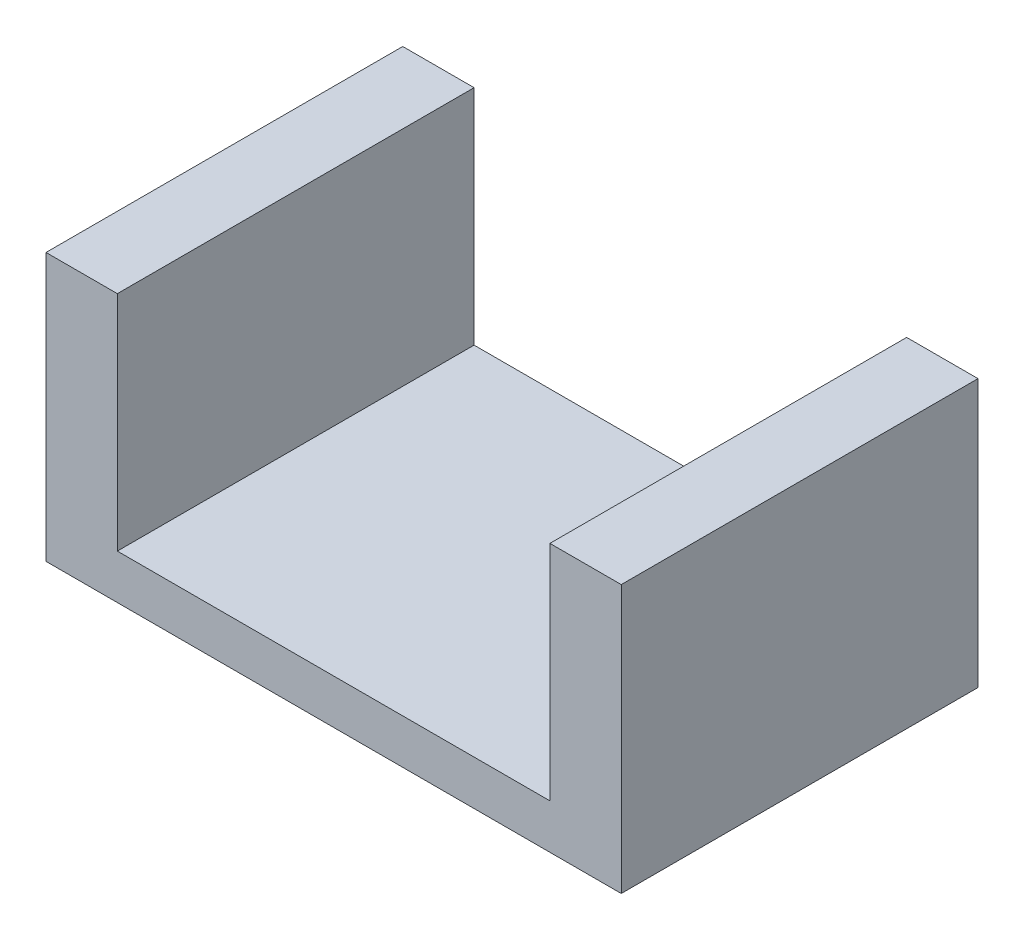
ISO-10303-21;
HEADER;
FILE_DESCRIPTION(('STEP AP214'),'2;1');
FILE_NAME('part.step','',(''),(''),'','','');
FILE_SCHEMA(('AUTOMOTIVE_DESIGN { 1 0 10303 214 1 1 1 1 }'));
ENDSEC;
DATA;
#1=APPLICATION_CONTEXT('core data for automotive mechanical design processes');
#2=APPLICATION_PROTOCOL_DEFINITION('international standard','automotive_design',2000,#1);
#3=PRODUCT_CONTEXT('',#1,'mechanical');
#4=PRODUCT('Part','Part','',(#3));
#5=PRODUCT_RELATED_PRODUCT_CATEGORY('part','',(#4));
#6=PRODUCT_DEFINITION_FORMATION('','',#4);
#7=PRODUCT_DEFINITION_CONTEXT('part definition',#1,'design');
#8=PRODUCT_DEFINITION('design','',#6,#7);
#9=PRODUCT_DEFINITION_SHAPE('','',#8);
#10=(LENGTH_UNIT() NAMED_UNIT(*) SI_UNIT(.MILLI.,.METRE.));
#11=(NAMED_UNIT(*) PLANE_ANGLE_UNIT() SI_UNIT($,.RADIAN.));
#12=(NAMED_UNIT(*) SI_UNIT($,.STERADIAN.) SOLID_ANGLE_UNIT());
#13=UNCERTAINTY_MEASURE_WITH_UNIT(LENGTH_MEASURE(1.E-05),#10,'distance_accuracy_value','');
#14=(GEOMETRIC_REPRESENTATION_CONTEXT(3) GLOBAL_UNCERTAINTY_ASSIGNED_CONTEXT((#13)) GLOBAL_UNIT_ASSIGNED_CONTEXT((#10,
#11,#12)) REPRESENTATION_CONTEXT('',''));
#15=CARTESIAN_POINT('',(0.,0.,0.));
#16=DIRECTION('',(0.,0.,1.));
#17=DIRECTION('',(1.,0.,0.));
#18=AXIS2_PLACEMENT_3D('',#15,#16,#17);
#19=CARTESIAN_POINT('',(-12.9,-15.,5.));
#20=DIRECTION('',(0.,1.,0.));
#21=DIRECTION('',(1.,0.,0.));
#22=AXIS2_PLACEMENT_3D('',#19,#20,#21);
#23=PLANE('',#22);
#24=DIRECTION('',(0.,0.,1.));
#25=VECTOR('',#24,1.);
#26=CARTESIAN_POINT('',(12.9,-15.,5.));
#27=LINE('',#26,#25);
#28=CARTESIAN_POINT('',(12.9,-15.,5.));
#29=VERTEX_POINT('',#28);
#30=CARTESIAN_POINT('',(12.9,-15.,21.));
#31=VERTEX_POINT('',#30);
#32=EDGE_CURVE('E165',#29,#31,#27,.T.);
#33=ORIENTED_EDGE('',*,*,#32,.T.);
#34=DIRECTION('',(-1.,0.,0.));
#35=VECTOR('',#34,1.);
#36=CARTESIAN_POINT('',(12.9,-15.,21.));
#37=LINE('',#36,#35);
#38=CARTESIAN_POINT('',(-12.9,-15.,21.));
#39=VERTEX_POINT('',#38);
#40=EDGE_CURVE('E129',#31,#39,#37,.T.);
#41=ORIENTED_EDGE('',*,*,#40,.T.);
#42=DIRECTION('',(0.,0.,1.));
#43=VECTOR('',#42,1.);
#44=CARTESIAN_POINT('',(-12.9,-15.,5.));
#45=LINE('',#44,#43);
#46=CARTESIAN_POINT('',(-12.9,-15.,5.));
#47=VERTEX_POINT('',#46);
#48=EDGE_CURVE('E123',#47,#39,#45,.T.);
#49=ORIENTED_EDGE('',*,*,#48,.F.);
#50=DIRECTION('',(1.,0.,0.));
#51=VECTOR('',#50,1.);
#52=CARTESIAN_POINT('',(-12.9,-15.,5.));
#53=LINE('',#52,#51);
#54=EDGE_CURVE('E9',#47,#29,#53,.T.);
#55=ORIENTED_EDGE('',*,*,#54,.T.);
#56=EDGE_LOOP('',(#33,#41,#49,#55));
#57=FACE_BOUND('',#56,.T.);
#58=ADVANCED_FACE('F15',(#57),#23,.F.);
#59=CARTESIAN_POINT('',(-12.9,-15.,5.));
#60=DIRECTION('',(0.,0.,1.));
#61=DIRECTION('',(1.,0.,0.));
#62=AXIS2_PLACEMENT_3D('',#59,#60,#61);
#63=PLANE('',#62);
#64=DIRECTION('',(1.,0.,0.));
#65=VECTOR('',#64,1.);
#66=CARTESIAN_POINT('',(-12.9,-3.,5.));
#67=LINE('',#66,#65);
#68=CARTESIAN_POINT('',(-12.9,-3.,5.));
#69=VERTEX_POINT('',#68);
#70=CARTESIAN_POINT('',(-9.7,-3.,5.));
#71=VERTEX_POINT('',#70);
#72=EDGE_CURVE('E24',#69,#71,#67,.T.);
#73=ORIENTED_EDGE('',*,*,#72,.T.);
#74=DIRECTION('',(0.,1.,0.));
#75=VECTOR('',#74,1.);
#76=CARTESIAN_POINT('',(-9.7,-15.,5.));
#77=LINE('',#76,#75);
#78=CARTESIAN_POINT('',(-9.7,-13.,5.));
#79=VERTEX_POINT('',#78);
#80=EDGE_CURVE('E101',#79,#71,#77,.T.);
#81=ORIENTED_EDGE('',*,*,#80,.F.);
#82=DIRECTION('',(1.,0.,0.));
#83=VECTOR('',#82,1.);
#84=CARTESIAN_POINT('',(-12.9,-13.,5.));
#85=LINE('',#84,#83);
#86=CARTESIAN_POINT('',(9.7,-13.,5.));
#87=VERTEX_POINT('',#86);
#88=EDGE_CURVE('E92',#79,#87,#85,.T.);
#89=ORIENTED_EDGE('',*,*,#88,.T.);
#90=DIRECTION('',(0.,1.,0.));
#91=VECTOR('',#90,1.);
#92=CARTESIAN_POINT('',(9.7,-15.,5.));
#93=LINE('',#92,#91);
#94=CARTESIAN_POINT('',(9.7,-3.,5.));
#95=VERTEX_POINT('',#94);
#96=EDGE_CURVE('E77',#87,#95,#93,.T.);
#97=ORIENTED_EDGE('',*,*,#96,.T.);
#98=DIRECTION('',(1.,0.,0.));
#99=VECTOR('',#98,1.);
#100=CARTESIAN_POINT('',(9.7,-3.,5.));
#101=LINE('',#100,#99);
#102=CARTESIAN_POINT('',(12.9,-3.,5.));
#103=VERTEX_POINT('',#102);
#104=EDGE_CURVE('E88',#95,#103,#101,.T.);
#105=ORIENTED_EDGE('',*,*,#104,.T.);
#106=DIRECTION('',(0.,-1.,0.));
#107=VECTOR('',#106,1.);
#108=CARTESIAN_POINT('',(12.9,-3.,5.));
#109=LINE('',#108,#107);
#110=EDGE_CURVE('E168',#103,#29,#109,.T.);
#111=ORIENTED_EDGE('',*,*,#110,.T.);
#112=ORIENTED_EDGE('',*,*,#54,.F.);
#113=DIRECTION('',(0.,-1.,0.));
#114=VECTOR('',#113,1.);
#115=CARTESIAN_POINT('',(-12.9,-3.,5.));
#116=LINE('',#115,#114);
#117=EDGE_CURVE('E119',#69,#47,#116,.T.);
#118=ORIENTED_EDGE('',*,*,#117,.F.);
#119=EDGE_LOOP('',(#73,#81,#89,#97,#105,#111,#112,#118));
#120=FACE_BOUND('',#119,.T.);
#121=ADVANCED_FACE('F99',(#120),#63,.F.);
#122=CARTESIAN_POINT('',(-12.9,-3.,5.));
#123=DIRECTION('',(0.,1.,0.));
#124=DIRECTION('',(1.,0.,0.));
#125=AXIS2_PLACEMENT_3D('',#122,#123,#124);
#126=PLANE('',#125);
#127=ORIENTED_EDGE('',*,*,#72,.F.);
#128=DIRECTION('',(0.,0.,1.));
#129=VECTOR('',#128,1.);
#130=CARTESIAN_POINT('',(-12.9,-3.,5.));
#131=LINE('',#130,#129);
#132=CARTESIAN_POINT('',(-12.9,-3.,21.));
#133=VERTEX_POINT('',#132);
#134=EDGE_CURVE('E115',#69,#133,#131,.T.);
#135=ORIENTED_EDGE('',*,*,#134,.T.);
#136=DIRECTION('',(1.,0.,0.));
#137=VECTOR('',#136,1.);
#138=CARTESIAN_POINT('',(-12.9,-3.,21.));
#139=LINE('',#138,#137);
#140=CARTESIAN_POINT('',(-9.7,-3.,21.));
#141=VERTEX_POINT('',#140);
#142=EDGE_CURVE('E148',#133,#141,#139,.T.);
#143=ORIENTED_EDGE('',*,*,#142,.T.);
#144=DIRECTION('',(0.,0.,1.));
#145=VECTOR('',#144,1.);
#146=CARTESIAN_POINT('',(-9.7,-3.,5.));
#147=LINE('',#146,#145);
#148=EDGE_CURVE('E104',#71,#141,#147,.T.);
#149=ORIENTED_EDGE('',*,*,#148,.F.);
#150=EDGE_LOOP('',(#127,#135,#143,#149));
#151=FACE_BOUND('',#150,.T.);
#152=ADVANCED_FACE('F177',(#151),#126,.T.);
#153=CARTESIAN_POINT('',(12.9,-15.,5.));
#154=DIRECTION('',(1.,0.,0.));
#155=DIRECTION('',(0.,1.,0.));
#156=AXIS2_PLACEMENT_3D('',#153,#154,#155);
#157=PLANE('',#156);
#158=ORIENTED_EDGE('',*,*,#32,.F.);
#159=ORIENTED_EDGE('',*,*,#110,.F.);
#160=DIRECTION('',(0.,0.,1.));
#161=VECTOR('',#160,1.);
#162=CARTESIAN_POINT('',(12.9,-3.,5.));
#163=LINE('',#162,#161);
#164=CARTESIAN_POINT('',(12.9,-3.,21.));
#165=VERTEX_POINT('',#164);
#166=EDGE_CURVE('E161',#103,#165,#163,.T.);
#167=ORIENTED_EDGE('',*,*,#166,.T.);
#168=DIRECTION('',(0.,1.,0.));
#169=VECTOR('',#168,1.);
#170=CARTESIAN_POINT('',(12.9,-15.,21.));
#171=LINE('',#170,#169);
#172=EDGE_CURVE('E124',#31,#165,#171,.T.);
#173=ORIENTED_EDGE('',*,*,#172,.F.);
#174=EDGE_LOOP('',(#158,#159,#167,#173));
#175=FACE_BOUND('',#174,.T.);
#176=ADVANCED_FACE('F228',(#175),#157,.T.);
#177=CARTESIAN_POINT('',(9.7,-3.,5.));
#178=DIRECTION('',(0.,1.,0.));
#179=DIRECTION('',(1.,0.,0.));
#180=AXIS2_PLACEMENT_3D('',#177,#178,#179);
#181=PLANE('',#180);
#182=ORIENTED_EDGE('',*,*,#104,.F.);
#183=DIRECTION('',(0.,0.,1.));
#184=VECTOR('',#183,1.);
#185=CARTESIAN_POINT('',(9.7,-3.,5.));
#186=LINE('',#185,#184);
#187=CARTESIAN_POINT('',(9.7,-3.,21.));
#188=VERTEX_POINT('',#187);
#189=EDGE_CURVE('E83',#95,#188,#186,.T.);
#190=ORIENTED_EDGE('',*,*,#189,.T.);
#191=DIRECTION('',(1.,0.,0.));
#192=VECTOR('',#191,1.);
#193=CARTESIAN_POINT('',(9.7,-3.,21.));
#194=LINE('',#193,#192);
#195=EDGE_CURVE('E128',#188,#165,#194,.T.);
#196=ORIENTED_EDGE('',*,*,#195,.T.);
#197=ORIENTED_EDGE('',*,*,#166,.F.);
#198=EDGE_LOOP('',(#182,#190,#196,#197));
#199=FACE_BOUND('',#198,.T.);
#200=ADVANCED_FACE('F190',(#199),#181,.T.);
#201=CARTESIAN_POINT('',(9.7,-15.,5.));
#202=DIRECTION('',(1.,0.,0.));
#203=DIRECTION('',(0.,1.,0.));
#204=AXIS2_PLACEMENT_3D('',#201,#202,#203);
#205=PLANE('',#204);
#206=ORIENTED_EDGE('',*,*,#189,.F.);
#207=ORIENTED_EDGE('',*,*,#96,.F.);
#208=DIRECTION('',(0.,0.,-1.));
#209=VECTOR('',#208,1.);
#210=CARTESIAN_POINT('',(9.7,-13.,5.));
#211=LINE('',#210,#209);
#212=CARTESIAN_POINT('',(9.7,-13.,21.));
#213=VERTEX_POINT('',#212);
#214=EDGE_CURVE('E81',#213,#87,#211,.T.);
#215=ORIENTED_EDGE('',*,*,#214,.F.);
#216=DIRECTION('',(0.,1.,0.));
#217=VECTOR('',#216,1.);
#218=CARTESIAN_POINT('',(9.7,-15.,21.));
#219=LINE('',#218,#217);
#220=EDGE_CURVE('E139',#213,#188,#219,.T.);
#221=ORIENTED_EDGE('',*,*,#220,.T.);
#222=EDGE_LOOP('',(#206,#207,#215,#221));
#223=FACE_BOUND('',#222,.T.);
#224=ADVANCED_FACE('F79',(#223),#205,.F.);
#225=CARTESIAN_POINT('',(-12.9,-13.,5.));
#226=DIRECTION('',(0.,1.,0.));
#227=DIRECTION('',(1.,0.,0.));
#228=AXIS2_PLACEMENT_3D('',#225,#226,#227);
#229=PLANE('',#228);
#230=ORIENTED_EDGE('',*,*,#88,.F.);
#231=DIRECTION('',(0.,0.,-1.));
#232=VECTOR('',#231,1.);
#233=CARTESIAN_POINT('',(-9.7,-13.,5.));
#234=LINE('',#233,#232);
#235=CARTESIAN_POINT('',(-9.7,-13.,21.));
#236=VERTEX_POINT('',#235);
#237=EDGE_CURVE('E149',#236,#79,#234,.T.);
#238=ORIENTED_EDGE('',*,*,#237,.F.);
#239=DIRECTION('',(1.,0.,0.));
#240=VECTOR('',#239,1.);
#241=CARTESIAN_POINT('',(-12.9,-13.,21.));
#242=LINE('',#241,#240);
#243=EDGE_CURVE('E95',#236,#213,#242,.T.);
#244=ORIENTED_EDGE('',*,*,#243,.T.);
#245=ORIENTED_EDGE('',*,*,#214,.T.);
#246=EDGE_LOOP('',(#230,#238,#244,#245));
#247=FACE_BOUND('',#246,.T.);
#248=ADVANCED_FACE('F91',(#247),#229,.T.);
#249=CARTESIAN_POINT('',(-9.7,-15.,5.));
#250=DIRECTION('',(1.,0.,0.));
#251=DIRECTION('',(0.,1.,0.));
#252=AXIS2_PLACEMENT_3D('',#249,#250,#251);
#253=PLANE('',#252);
#254=DIRECTION('',(0.,1.,0.));
#255=VECTOR('',#254,1.);
#256=CARTESIAN_POINT('',(-9.7,-15.,21.));
#257=LINE('',#256,#255);
#258=EDGE_CURVE('E144',#236,#141,#257,.T.);
#259=ORIENTED_EDGE('',*,*,#258,.F.);
#260=ORIENTED_EDGE('',*,*,#237,.T.);
#261=ORIENTED_EDGE('',*,*,#80,.T.);
#262=ORIENTED_EDGE('',*,*,#148,.T.);
#263=EDGE_LOOP('',(#259,#260,#261,#262));
#264=FACE_BOUND('',#263,.T.);
#265=ADVANCED_FACE('F181',(#264),#253,.T.);
#266=CARTESIAN_POINT('',(-12.9,-15.,21.));
#267=DIRECTION('',(0.,0.,1.));
#268=DIRECTION('',(1.,0.,0.));
#269=AXIS2_PLACEMENT_3D('',#266,#267,#268);
#270=PLANE('',#269);
#271=DIRECTION('',(0.,1.,0.));
#272=VECTOR('',#271,1.);
#273=CARTESIAN_POINT('',(-12.9,-15.,21.));
#274=LINE('',#273,#272);
#275=EDGE_CURVE('E112',#39,#133,#274,.T.);
#276=ORIENTED_EDGE('',*,*,#275,.F.);
#277=ORIENTED_EDGE('',*,*,#40,.F.);
#278=ORIENTED_EDGE('',*,*,#172,.T.);
#279=ORIENTED_EDGE('',*,*,#195,.F.);
#280=ORIENTED_EDGE('',*,*,#220,.F.);
#281=ORIENTED_EDGE('',*,*,#243,.F.);
#282=ORIENTED_EDGE('',*,*,#258,.T.);
#283=ORIENTED_EDGE('',*,*,#142,.F.);
#284=EDGE_LOOP('',(#276,#277,#278,#279,#280,#281,#282,#283));
#285=FACE_BOUND('',#284,.T.);
#286=ADVANCED_FACE('F184',(#285),#270,.T.);
#287=CARTESIAN_POINT('',(-12.9,-15.,5.));
#288=DIRECTION('',(1.,0.,0.));
#289=DIRECTION('',(0.,1.,0.));
#290=AXIS2_PLACEMENT_3D('',#287,#288,#289);
#291=PLANE('',#290);
#292=ORIENTED_EDGE('',*,*,#275,.T.);
#293=ORIENTED_EDGE('',*,*,#134,.F.);
#294=ORIENTED_EDGE('',*,*,#117,.T.);
#295=ORIENTED_EDGE('',*,*,#48,.T.);
#296=EDGE_LOOP('',(#292,#293,#294,#295));
#297=FACE_BOUND('',#296,.T.);
#298=ADVANCED_FACE('F208',(#297),#291,.F.);
#299=CLOSED_SHELL('',(#58,#121,#152,#176,#200,#224,#248,#265,#286,#298));
#300=MANIFOLD_SOLID_BREP('B1',#299);
#301=ADVANCED_BREP_SHAPE_REPRESENTATION('',(#18,#300),#14);
#302=SHAPE_DEFINITION_REPRESENTATION(#9,#301);
ENDSEC;
END-ISO-10303-21;
